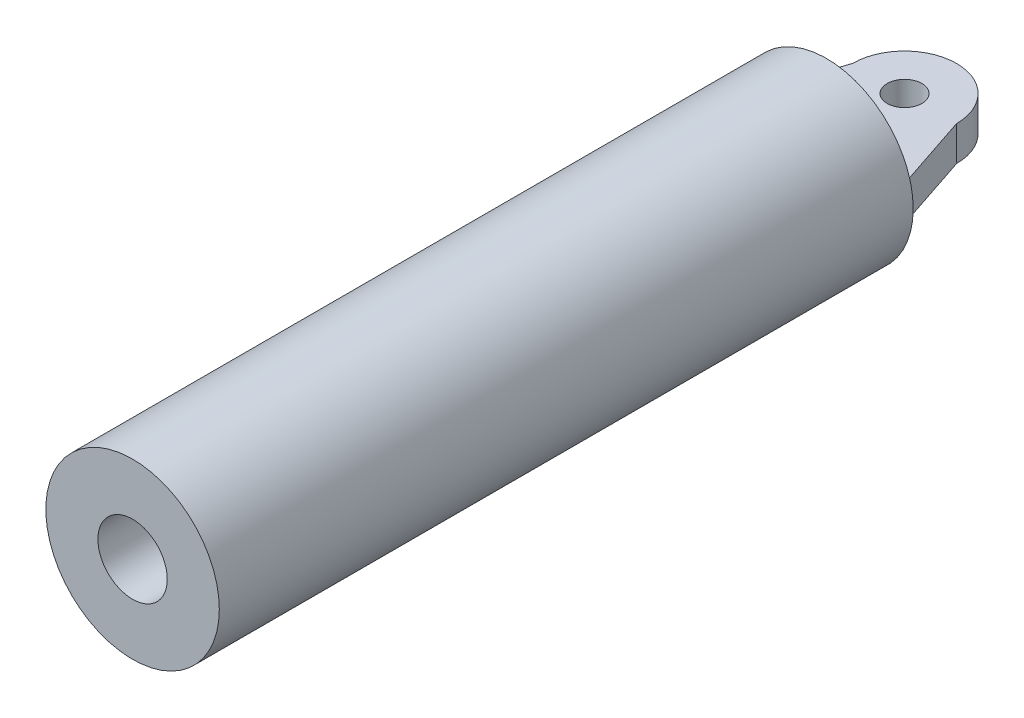
ISO-10303-21;
HEADER;
FILE_DESCRIPTION(('STEP AP214'),'2;1');
FILE_NAME('part.step','',(''),(''),'','','');
FILE_SCHEMA(('AUTOMOTIVE_DESIGN { 1 0 10303 214 1 1 1 1 }'));
ENDSEC;
DATA;
#1=APPLICATION_CONTEXT('core data for automotive mechanical design processes');
#2=APPLICATION_PROTOCOL_DEFINITION('international standard','automotive_design',2000,#1);
#3=PRODUCT_CONTEXT('',#1,'mechanical');
#4=PRODUCT('Part','Part','',(#3));
#5=PRODUCT_RELATED_PRODUCT_CATEGORY('part','',(#4));
#6=PRODUCT_DEFINITION_FORMATION('','',#4);
#7=PRODUCT_DEFINITION_CONTEXT('part definition',#1,'design');
#8=PRODUCT_DEFINITION('design','',#6,#7);
#9=PRODUCT_DEFINITION_SHAPE('','',#8);
#10=(LENGTH_UNIT() NAMED_UNIT(*) SI_UNIT(.MILLI.,.METRE.));
#11=(NAMED_UNIT(*) PLANE_ANGLE_UNIT() SI_UNIT($,.RADIAN.));
#12=(NAMED_UNIT(*) SI_UNIT($,.STERADIAN.) SOLID_ANGLE_UNIT());
#13=UNCERTAINTY_MEASURE_WITH_UNIT(LENGTH_MEASURE(1.E-05),#10,'distance_accuracy_value','');
#14=(GEOMETRIC_REPRESENTATION_CONTEXT(3) GLOBAL_UNCERTAINTY_ASSIGNED_CONTEXT((#13)) GLOBAL_UNIT_ASSIGNED_CONTEXT((#10,
#11,#12)) REPRESENTATION_CONTEXT('',''));
#15=CARTESIAN_POINT('',(0.,0.,0.));
#16=DIRECTION('',(0.,0.,1.));
#17=DIRECTION('',(1.,0.,0.));
#18=AXIS2_PLACEMENT_3D('',#15,#16,#17);
#19=CARTESIAN_POINT('',(0.,0.,400.));
#20=DIRECTION('',(0.,0.,-1.));
#21=DIRECTION('',(-1.,0.,0.));
#22=AXIS2_PLACEMENT_3D('',#19,#20,#21);
#23=CYLINDRICAL_SURFACE('',#22,50.);
#24=CARTESIAN_POINT('',(0.,0.,400.));
#25=DIRECTION('',(0.,0.,1.));
#26=DIRECTION('',(1.,0.,0.));
#27=AXIS2_PLACEMENT_3D('',#24,#25,#26);
#28=CIRCLE('',#27,50.);
#29=CARTESIAN_POINT('',(50.,0.,400.));
#30=VERTEX_POINT('',#29);
#31=EDGE_CURVE('E11',#30,#30,#28,.T.);
#32=ORIENTED_EDGE('',*,*,#31,.F.);
#33=EDGE_LOOP('',(#32));
#34=FACE_BOUND('',#33,.T.);
#35=CARTESIAN_POINT('',(0.,0.,0.));
#36=DIRECTION('',(0.,0.,1.));
#37=DIRECTION('',(1.,0.,0.));
#38=AXIS2_PLACEMENT_3D('',#35,#36,#37);
#39=CIRCLE('',#38,50.);
#40=CARTESIAN_POINT('',(50.,0.,0.));
#41=VERTEX_POINT('',#40);
#42=EDGE_CURVE('E39',#41,#41,#39,.T.);
#43=ORIENTED_EDGE('',*,*,#42,.T.);
#44=EDGE_LOOP('',(#43));
#45=FACE_BOUND('',#44,.T.);
#46=ADVANCED_FACE('F36',(#34,#45),#23,.T.);
#47=CARTESIAN_POINT('',(0.,0.,400.));
#48=DIRECTION('',(0.,0.,1.));
#49=DIRECTION('',(1.,0.,0.));
#50=AXIS2_PLACEMENT_3D('',#47,#48,#49);
#51=PLANE('',#50);
#52=CARTESIAN_POINT('',(0.,0.,400.));
#53=DIRECTION('',(0.,0.,1.));
#54=DIRECTION('',(1.,0.,0.));
#55=AXIS2_PLACEMENT_3D('',#52,#53,#54);
#56=CIRCLE('',#55,20.);
#57=CARTESIAN_POINT('',(20.,0.,400.));
#58=VERTEX_POINT('',#57);
#59=EDGE_CURVE('E108',#58,#58,#56,.T.);
#60=ORIENTED_EDGE('',*,*,#59,.F.);
#61=EDGE_LOOP('',(#60));
#62=FACE_BOUND('',#61,.T.);
#63=ORIENTED_EDGE('',*,*,#31,.T.);
#64=EDGE_LOOP('',(#63));
#65=FACE_BOUND('',#64,.T.);
#66=ADVANCED_FACE('F139',(#62,#65),#51,.T.);
#67=CARTESIAN_POINT('',(0.,0.,0.));
#68=DIRECTION('',(0.,0.,1.));
#69=DIRECTION('',(1.,0.,0.));
#70=AXIS2_PLACEMENT_3D('',#67,#68,#69);
#71=PLANE('',#70);
#72=DIRECTION('',(0.,-1.,0.));
#73=VECTOR('',#72,1.);
#74=CARTESIAN_POINT('',(45.,10.,0.));
#75=LINE('',#74,#73);
#76=CARTESIAN_POINT('',(45.,10.,0.));
#77=VERTEX_POINT('',#76);
#78=CARTESIAN_POINT('',(45.,-10.,0.));
#79=VERTEX_POINT('',#78);
#80=EDGE_CURVE('E55',#77,#79,#75,.T.);
#81=ORIENTED_EDGE('',*,*,#80,.F.);
#82=DIRECTION('',(1.,0.,0.));
#83=VECTOR('',#82,1.);
#84=CARTESIAN_POINT('',(0.,10.,0.));
#85=LINE('',#84,#83);
#86=CARTESIAN_POINT('',(-45.,10.,0.));
#87=VERTEX_POINT('',#86);
#88=EDGE_CURVE('E50',#87,#77,#85,.T.);
#89=ORIENTED_EDGE('',*,*,#88,.F.);
#90=DIRECTION('',(0.,-1.,0.));
#91=VECTOR('',#90,1.);
#92=CARTESIAN_POINT('',(-45.,10.,0.));
#93=LINE('',#92,#91);
#94=CARTESIAN_POINT('',(-45.,-10.,0.));
#95=VERTEX_POINT('',#94);
#96=EDGE_CURVE('E85',#87,#95,#93,.T.);
#97=ORIENTED_EDGE('',*,*,#96,.T.);
#98=DIRECTION('',(1.,0.,0.));
#99=VECTOR('',#98,1.);
#100=CARTESIAN_POINT('',(0.,-10.,0.));
#101=LINE('',#100,#99);
#102=EDGE_CURVE('E110',#95,#79,#101,.T.);
#103=ORIENTED_EDGE('',*,*,#102,.T.);
#104=EDGE_LOOP('',(#81,#89,#97,#103));
#105=FACE_BOUND('',#104,.T.);
#106=ORIENTED_EDGE('',*,*,#42,.F.);
#107=EDGE_LOOP('',(#106));
#108=FACE_BOUND('',#107,.T.);
#109=ADVANCED_FACE('F120',(#105,#108),#71,.F.);
#110=CARTESIAN_POINT('',(0.,10.,-45.));
#111=DIRECTION('',(0.,-1.,0.));
#112=DIRECTION('',(0.,0.,-1.));
#113=AXIS2_PLACEMENT_3D('',#110,#111,#112);
#114=CYLINDRICAL_SURFACE('',#113,30.);
#115=CARTESIAN_POINT('',(0.,-10.,-45.));
#116=DIRECTION('',(0.,1.,0.));
#117=DIRECTION('',(0.,0.,1.));
#118=AXIS2_PLACEMENT_3D('',#115,#116,#117);
#119=CIRCLE('',#118,30.);
#120=CARTESIAN_POINT('',(-30.,-10.,-45.));
#121=VERTEX_POINT('',#120);
#122=CARTESIAN_POINT('',(30.,-10.,-45.));
#123=VERTEX_POINT('',#122);
#124=EDGE_CURVE('E80',#121,#123,#119,.F.);
#125=ORIENTED_EDGE('',*,*,#124,.F.);
#126=DIRECTION('',(0.,-1.,0.));
#127=VECTOR('',#126,1.);
#128=CARTESIAN_POINT('',(-30.,10.,-45.));
#129=LINE('',#128,#127);
#130=CARTESIAN_POINT('',(-30.,10.,-45.));
#131=VERTEX_POINT('',#130);
#132=EDGE_CURVE('E74',#131,#121,#129,.T.);
#133=ORIENTED_EDGE('',*,*,#132,.F.);
#134=CARTESIAN_POINT('',(0.,10.,-45.));
#135=DIRECTION('',(0.,1.,0.));
#136=DIRECTION('',(0.,0.,1.));
#137=AXIS2_PLACEMENT_3D('',#134,#135,#136);
#138=CIRCLE('',#137,30.);
#139=CARTESIAN_POINT('',(30.,10.,-45.));
#140=VERTEX_POINT('',#139);
#141=EDGE_CURVE('E77',#131,#140,#138,.F.);
#142=ORIENTED_EDGE('',*,*,#141,.T.);
#143=DIRECTION('',(0.,-1.,0.));
#144=VECTOR('',#143,1.);
#145=CARTESIAN_POINT('',(30.,10.,-45.));
#146=LINE('',#145,#144);
#147=EDGE_CURVE('E105',#140,#123,#146,.T.);
#148=ORIENTED_EDGE('',*,*,#147,.T.);
#149=EDGE_LOOP('',(#125,#133,#142,#148));
#150=FACE_BOUND('',#149,.T.);
#151=ADVANCED_FACE('F76',(#150),#114,.T.);
#152=CARTESIAN_POINT('',(-40.5,10.,-13.5));
#153=DIRECTION('',(-0.948683298050514,0.,-0.316227766016838));
#154=DIRECTION('',(-0.316227766016838,0.,0.948683298050514));
#155=AXIS2_PLACEMENT_3D('',#152,#153,#154);
#156=PLANE('',#155);
#157=DIRECTION('',(0.316227766016838,0.,-0.948683298050514));
#158=VECTOR('',#157,1.);
#159=CARTESIAN_POINT('',(-40.5,-10.,-13.5));
#160=LINE('',#159,#158);
#161=EDGE_CURVE('E107',#95,#121,#160,.T.);
#162=ORIENTED_EDGE('',*,*,#161,.F.);
#163=ORIENTED_EDGE('',*,*,#96,.F.);
#164=DIRECTION('',(0.316227766016838,0.,-0.948683298050514));
#165=VECTOR('',#164,1.);
#166=CARTESIAN_POINT('',(-40.5,10.,-13.5));
#167=LINE('',#166,#165);
#168=EDGE_CURVE('E91',#87,#131,#167,.T.);
#169=ORIENTED_EDGE('',*,*,#168,.T.);
#170=ORIENTED_EDGE('',*,*,#132,.T.);
#171=EDGE_LOOP('',(#162,#163,#169,#170));
#172=FACE_BOUND('',#171,.T.);
#173=ADVANCED_FACE('F96',(#172),#156,.T.);
#174=CARTESIAN_POINT('',(40.5,10.,-13.5));
#175=DIRECTION('',(0.948683298050514,0.,-0.316227766016838));
#176=DIRECTION('',(-0.316227766016838,0.,-0.948683298050514));
#177=AXIS2_PLACEMENT_3D('',#174,#175,#176);
#178=PLANE('',#177);
#179=DIRECTION('',(0.316227766016838,0.,0.948683298050514));
#180=VECTOR('',#179,1.);
#181=CARTESIAN_POINT('',(40.5,-10.,-13.5));
#182=LINE('',#181,#180);
#183=EDGE_CURVE('E112',#123,#79,#182,.T.);
#184=ORIENTED_EDGE('',*,*,#183,.F.);
#185=ORIENTED_EDGE('',*,*,#147,.F.);
#186=DIRECTION('',(0.316227766016838,0.,0.948683298050514));
#187=VECTOR('',#186,1.);
#188=CARTESIAN_POINT('',(40.5,10.,-13.5));
#189=LINE('',#188,#187);
#190=EDGE_CURVE('E93',#140,#77,#189,.T.);
#191=ORIENTED_EDGE('',*,*,#190,.T.);
#192=ORIENTED_EDGE('',*,*,#80,.T.);
#193=EDGE_LOOP('',(#184,#185,#191,#192));
#194=FACE_BOUND('',#193,.T.);
#195=ADVANCED_FACE('F127',(#194),#178,.T.);
#196=CARTESIAN_POINT('',(0.,10.,-45.));
#197=DIRECTION('',(0.,-1.,0.));
#198=DIRECTION('',(0.,0.,-1.));
#199=AXIS2_PLACEMENT_3D('',#196,#197,#198);
#200=CYLINDRICAL_SURFACE('',#199,10.);
#201=CARTESIAN_POINT('',(0.,10.,-45.));
#202=DIRECTION('',(0.,1.,0.));
#203=DIRECTION('',(0.,0.,1.));
#204=AXIS2_PLACEMENT_3D('',#201,#202,#203);
#205=CIRCLE('',#204,10.);
#206=CARTESIAN_POINT('',(0.,10.,-35.));
#207=VERTEX_POINT('',#206);
#208=EDGE_CURVE('E102',#207,#207,#205,.T.);
#209=ORIENTED_EDGE('',*,*,#208,.T.);
#210=EDGE_LOOP('',(#209));
#211=FACE_BOUND('',#210,.T.);
#212=CARTESIAN_POINT('',(0.,-10.,-45.));
#213=DIRECTION('',(0.,1.,0.));
#214=DIRECTION('',(0.,0.,1.));
#215=AXIS2_PLACEMENT_3D('',#212,#213,#214);
#216=CIRCLE('',#215,10.);
#217=CARTESIAN_POINT('',(0.,-10.,-35.));
#218=VERTEX_POINT('',#217);
#219=EDGE_CURVE('E94',#218,#218,#216,.T.);
#220=ORIENTED_EDGE('',*,*,#219,.F.);
#221=EDGE_LOOP('',(#220));
#222=FACE_BOUND('',#221,.T.);
#223=ADVANCED_FACE('F129',(#211,#222),#200,.F.);
#224=CARTESIAN_POINT('',(0.,10.,0.));
#225=DIRECTION('',(0.,1.,0.));
#226=DIRECTION('',(0.,0.,1.));
#227=AXIS2_PLACEMENT_3D('',#224,#225,#226);
#228=PLANE('',#227);
#229=ORIENTED_EDGE('',*,*,#141,.F.);
#230=ORIENTED_EDGE('',*,*,#168,.F.);
#231=ORIENTED_EDGE('',*,*,#88,.T.);
#232=ORIENTED_EDGE('',*,*,#190,.F.);
#233=EDGE_LOOP('',(#229,#230,#231,#232));
#234=FACE_BOUND('',#233,.T.);
#235=ORIENTED_EDGE('',*,*,#208,.F.);
#236=EDGE_LOOP('',(#235));
#237=FACE_BOUND('',#236,.T.);
#238=ADVANCED_FACE('F89',(#234,#237),#228,.T.);
#239=CARTESIAN_POINT('',(0.,-10.,0.));
#240=DIRECTION('',(0.,1.,0.));
#241=DIRECTION('',(0.,0.,1.));
#242=AXIS2_PLACEMENT_3D('',#239,#240,#241);
#243=PLANE('',#242);
#244=ORIENTED_EDGE('',*,*,#124,.T.);
#245=ORIENTED_EDGE('',*,*,#183,.T.);
#246=ORIENTED_EDGE('',*,*,#102,.F.);
#247=ORIENTED_EDGE('',*,*,#161,.T.);
#248=EDGE_LOOP('',(#244,#245,#246,#247));
#249=FACE_BOUND('',#248,.T.);
#250=ORIENTED_EDGE('',*,*,#219,.T.);
#251=EDGE_LOOP('',(#250));
#252=FACE_BOUND('',#251,.T.);
#253=ADVANCED_FACE('F123',(#249,#252),#243,.F.);
#254=CARTESIAN_POINT('',(0.,0.,400.));
#255=DIRECTION('',(0.,0.,-1.));
#256=DIRECTION('',(-1.,0.,0.));
#257=AXIS2_PLACEMENT_3D('',#254,#255,#256);
#258=CYLINDRICAL_SURFACE('',#257,20.);
#259=ORIENTED_EDGE('',*,*,#59,.T.);
#260=EDGE_LOOP('',(#259));
#261=FACE_BOUND('',#260,.T.);
#262=CARTESIAN_POINT('',(0.,0.,30.));
#263=DIRECTION('',(0.,0.,1.));
#264=DIRECTION('',(1.,0.,0.));
#265=AXIS2_PLACEMENT_3D('',#262,#263,#264);
#266=CIRCLE('',#265,20.);
#267=CARTESIAN_POINT('',(20.,0.,30.));
#268=VERTEX_POINT('',#267);
#269=EDGE_CURVE('E249',#268,#268,#266,.T.);
#270=ORIENTED_EDGE('',*,*,#269,.F.);
#271=EDGE_LOOP('',(#270));
#272=FACE_BOUND('',#271,.T.);
#273=ADVANCED_FACE('F187',(#261,#272),#258,.F.);
#274=CARTESIAN_POINT('',(0.,0.,30.));
#275=DIRECTION('',(0.,0.,1.));
#276=DIRECTION('',(1.,0.,0.));
#277=AXIS2_PLACEMENT_3D('',#274,#275,#276);
#278=PLANE('',#277);
#279=ORIENTED_EDGE('',*,*,#269,.T.);
#280=EDGE_LOOP('',(#279));
#281=FACE_BOUND('',#280,.T.);
#282=ADVANCED_FACE('F192',(#281),#278,.T.);
#283=CLOSED_SHELL('',(#46,#66,#109,#151,#173,#195,#223,#238,#253,#273,#282));
#284=MANIFOLD_SOLID_BREP('B2',#283);
#285=ADVANCED_BREP_SHAPE_REPRESENTATION('',(#18,#284),#14);
#286=SHAPE_DEFINITION_REPRESENTATION(#9,#285);
ENDSEC;
END-ISO-10303-21;
